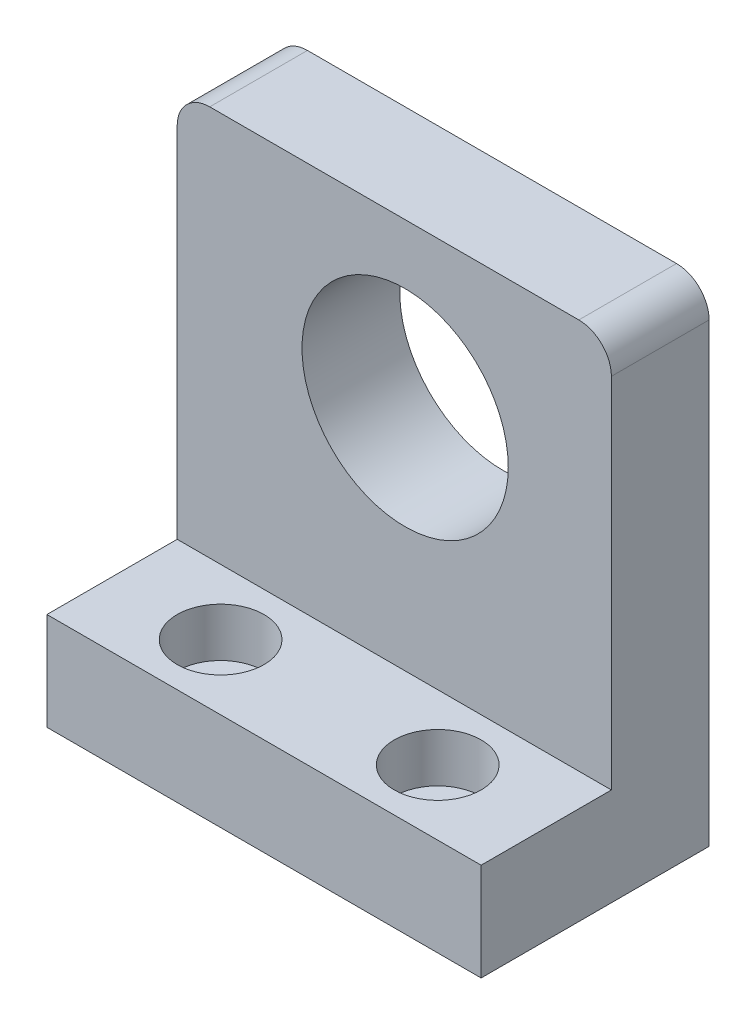
ISO-10303-21;
HEADER;
FILE_DESCRIPTION(('STEP AP214'),'2;1');
FILE_NAME('part.step','',(''),(''),'','','');
FILE_SCHEMA(('AUTOMOTIVE_DESIGN { 1 0 10303 214 1 1 1 1 }'));
ENDSEC;
DATA;
#1=APPLICATION_CONTEXT('core data for automotive mechanical design processes');
#2=APPLICATION_PROTOCOL_DEFINITION('international standard','automotive_design',2000,#1);
#3=PRODUCT_CONTEXT('',#1,'mechanical');
#4=PRODUCT('Part','Part','',(#3));
#5=PRODUCT_RELATED_PRODUCT_CATEGORY('part','',(#4));
#6=PRODUCT_DEFINITION_FORMATION('','',#4);
#7=PRODUCT_DEFINITION_CONTEXT('part definition',#1,'design');
#8=PRODUCT_DEFINITION('design','',#6,#7);
#9=PRODUCT_DEFINITION_SHAPE('','',#8);
#10=(LENGTH_UNIT() NAMED_UNIT(*) SI_UNIT(.MILLI.,.METRE.));
#11=(NAMED_UNIT(*) PLANE_ANGLE_UNIT() SI_UNIT($,.RADIAN.));
#12=(NAMED_UNIT(*) SI_UNIT($,.STERADIAN.) SOLID_ANGLE_UNIT());
#13=UNCERTAINTY_MEASURE_WITH_UNIT(LENGTH_MEASURE(1.E-05),#10,'distance_accuracy_value','');
#14=(GEOMETRIC_REPRESENTATION_CONTEXT(3) GLOBAL_UNCERTAINTY_ASSIGNED_CONTEXT((#13)) GLOBAL_UNIT_ASSIGNED_CONTEXT((#10,
#11,#12)) REPRESENTATION_CONTEXT('',''));
#15=CARTESIAN_POINT('',(0.,0.,0.));
#16=DIRECTION('',(0.,0.,1.));
#17=DIRECTION('',(1.,0.,0.));
#18=AXIS2_PLACEMENT_3D('',#15,#16,#17);
#19=CARTESIAN_POINT('',(10.,-22.5,15.));
#20=DIRECTION('',(0.,1.,0.));
#21=DIRECTION('',(0.,0.,1.));
#22=AXIS2_PLACEMENT_3D('',#19,#20,#21);
#23=CYLINDRICAL_SURFACE('',#22,2.);
#24=CARTESIAN_POINT('',(10.,-22.5,15.));
#25=DIRECTION('',(0.,1.,0.));
#26=DIRECTION('',(0.,0.,1.));
#27=AXIS2_PLACEMENT_3D('',#24,#25,#26);
#28=CIRCLE('',#27,2.);
#29=CARTESIAN_POINT('',(10.,-22.5,17.));
#30=VERTEX_POINT('',#29);
#31=EDGE_CURVE('E174',#30,#30,#28,.T.);
#32=ORIENTED_EDGE('',*,*,#31,.F.);
#33=EDGE_LOOP('',(#32));
#34=FACE_BOUND('',#33,.T.);
#35=CARTESIAN_POINT('',(10.,-18.,15.));
#36=DIRECTION('',(0.,1.,0.));
#37=DIRECTION('',(0.,0.,1.));
#38=AXIS2_PLACEMENT_3D('',#35,#36,#37);
#39=CIRCLE('',#38,2.);
#40=CARTESIAN_POINT('',(10.,-18.,17.));
#41=VERTEX_POINT('',#40);
#42=EDGE_CURVE('E37',#41,#41,#39,.F.);
#43=ORIENTED_EDGE('',*,*,#42,.F.);
#44=EDGE_LOOP('',(#43));
#45=FACE_BOUND('',#44,.T.);
#46=ADVANCED_FACE('F33',(#34,#45),#23,.F.);
#47=CARTESIAN_POINT('',(-10.,-22.5,15.));
#48=DIRECTION('',(0.,1.,0.));
#49=DIRECTION('',(0.,0.,1.));
#50=AXIS2_PLACEMENT_3D('',#47,#48,#49);
#51=CYLINDRICAL_SURFACE('',#50,2.);
#52=CARTESIAN_POINT('',(-10.,-22.5,15.));
#53=DIRECTION('',(0.,1.,0.));
#54=DIRECTION('',(0.,0.,1.));
#55=AXIS2_PLACEMENT_3D('',#52,#53,#54);
#56=CIRCLE('',#55,2.);
#57=CARTESIAN_POINT('',(-10.,-22.5,17.));
#58=VERTEX_POINT('',#57);
#59=EDGE_CURVE('E129',#58,#58,#56,.T.);
#60=ORIENTED_EDGE('',*,*,#59,.F.);
#61=EDGE_LOOP('',(#60));
#62=FACE_BOUND('',#61,.T.);
#63=CARTESIAN_POINT('',(-10.,-18.,15.));
#64=DIRECTION('',(0.,1.,0.));
#65=DIRECTION('',(0.,0.,1.));
#66=AXIS2_PLACEMENT_3D('',#63,#64,#65);
#67=CIRCLE('',#66,2.);
#68=CARTESIAN_POINT('',(-10.,-18.,17.));
#69=VERTEX_POINT('',#68);
#70=EDGE_CURVE('E172',#69,#69,#67,.F.);
#71=ORIENTED_EDGE('',*,*,#70,.F.);
#72=EDGE_LOOP('',(#71));
#73=FACE_BOUND('',#72,.T.);
#74=ADVANCED_FACE('F200',(#62,#73),#51,.F.);
#75=CARTESIAN_POINT('',(-17.,19.5,9.));
#76=DIRECTION('',(0.,0.,1.));
#77=DIRECTION('',(1.,0.,0.));
#78=AXIS2_PLACEMENT_3D('',#75,#76,#77);
#79=PLANE('',#78);
#80=DIRECTION('',(-1.,0.,0.));
#81=VECTOR('',#80,1.);
#82=CARTESIAN_POINT('',(-20.,-13.5,9.));
#83=LINE('',#82,#81);
#84=CARTESIAN_POINT('',(20.,-13.5,9.));
#85=VERTEX_POINT('',#84);
#86=CARTESIAN_POINT('',(-20.,-13.5,9.));
#87=VERTEX_POINT('',#86);
#88=EDGE_CURVE('E50',#85,#87,#83,.T.);
#89=ORIENTED_EDGE('',*,*,#88,.F.);
#90=DIRECTION('',(0.,1.,0.));
#91=VECTOR('',#90,1.);
#92=CARTESIAN_POINT('',(20.,19.5,9.));
#93=LINE('',#92,#91);
#94=CARTESIAN_POINT('',(20.,19.5,9.));
#95=VERTEX_POINT('',#94);
#96=EDGE_CURVE('E89',#85,#95,#93,.T.);
#97=ORIENTED_EDGE('',*,*,#96,.T.);
#98=CARTESIAN_POINT('',(17.,19.5,9.));
#99=DIRECTION('',(0.,0.,1.));
#100=DIRECTION('',(-1.,0.,0.));
#101=AXIS2_PLACEMENT_3D('',#98,#99,#100);
#102=CIRCLE('',#101,3.);
#103=CARTESIAN_POINT('',(17.,22.5,9.));
#104=VERTEX_POINT('',#103);
#105=EDGE_CURVE('E149',#95,#104,#102,.T.);
#106=ORIENTED_EDGE('',*,*,#105,.T.);
#107=DIRECTION('',(-1.,0.,0.));
#108=VECTOR('',#107,1.);
#109=CARTESIAN_POINT('',(-17.,22.5,9.));
#110=LINE('',#109,#108);
#111=CARTESIAN_POINT('',(-17.,22.5,9.));
#112=VERTEX_POINT('',#111);
#113=EDGE_CURVE('E151',#104,#112,#110,.T.);
#114=ORIENTED_EDGE('',*,*,#113,.T.);
#115=CARTESIAN_POINT('',(-17.,19.5,9.));
#116=DIRECTION('',(0.,0.,1.));
#117=DIRECTION('',(1.,0.,0.));
#118=AXIS2_PLACEMENT_3D('',#115,#116,#117);
#119=CIRCLE('',#118,3.);
#120=CARTESIAN_POINT('',(-20.,19.5,9.));
#121=VERTEX_POINT('',#120);
#122=EDGE_CURVE('E57',#112,#121,#119,.T.);
#123=ORIENTED_EDGE('',*,*,#122,.T.);
#124=DIRECTION('',(0.,-1.,0.));
#125=VECTOR('',#124,1.);
#126=CARTESIAN_POINT('',(-20.,19.5,9.));
#127=LINE('',#126,#125);
#128=EDGE_CURVE('E154',#121,#87,#127,.T.);
#129=ORIENTED_EDGE('',*,*,#128,.T.);
#130=EDGE_LOOP('',(#89,#97,#106,#114,#123,#129));
#131=FACE_BOUND('',#130,.T.);
#132=CARTESIAN_POINT('',(0.999999999999997,7.49999999999999,9.));
#133=DIRECTION('',(0.,0.,1.));
#134=DIRECTION('',(1.,0.,0.));
#135=AXIS2_PLACEMENT_3D('',#132,#133,#134);
#136=CIRCLE('',#135,9.5);
#137=CARTESIAN_POINT('',(10.5,7.49999999999999,9.));
#138=VERTEX_POINT('',#137);
#139=EDGE_CURVE('E142',#138,#138,#136,.T.);
#140=ORIENTED_EDGE('',*,*,#139,.F.);
#141=EDGE_LOOP('',(#140));
#142=FACE_BOUND('',#141,.T.);
#143=ADVANCED_FACE('F206',(#131,#142),#79,.T.);
#144=CARTESIAN_POINT('',(-17.,19.5,0.));
#145=DIRECTION('',(0.,0.,1.));
#146=DIRECTION('',(1.,0.,0.));
#147=AXIS2_PLACEMENT_3D('',#144,#145,#146);
#148=PLANE('',#147);
#149=DIRECTION('',(0.,1.,0.));
#150=VECTOR('',#149,1.);
#151=CARTESIAN_POINT('',(20.,19.5,0.));
#152=LINE('',#151,#150);
#153=CARTESIAN_POINT('',(20.,-22.5,0.));
#154=VERTEX_POINT('',#153);
#155=CARTESIAN_POINT('',(20.,19.5,0.));
#156=VERTEX_POINT('',#155);
#157=EDGE_CURVE('E145',#154,#156,#152,.T.);
#158=ORIENTED_EDGE('',*,*,#157,.F.);
#159=DIRECTION('',(1.,0.,0.));
#160=VECTOR('',#159,1.);
#161=CARTESIAN_POINT('',(-20.,-22.5,0.));
#162=LINE('',#161,#160);
#163=CARTESIAN_POINT('',(-20.,-22.5,0.));
#164=VERTEX_POINT('',#163);
#165=EDGE_CURVE('E85',#164,#154,#162,.T.);
#166=ORIENTED_EDGE('',*,*,#165,.F.);
#167=DIRECTION('',(0.,-1.,0.));
#168=VECTOR('',#167,1.);
#169=CARTESIAN_POINT('',(-20.,19.5,0.));
#170=LINE('',#169,#168);
#171=CARTESIAN_POINT('',(-20.,19.5,0.));
#172=VERTEX_POINT('',#171);
#173=EDGE_CURVE('E113',#172,#164,#170,.T.);
#174=ORIENTED_EDGE('',*,*,#173,.F.);
#175=CARTESIAN_POINT('',(-17.,19.5,0.));
#176=DIRECTION('',(0.,0.,1.));
#177=DIRECTION('',(1.,0.,0.));
#178=AXIS2_PLACEMENT_3D('',#175,#176,#177);
#179=CIRCLE('',#178,3.);
#180=CARTESIAN_POINT('',(-17.,22.5,0.));
#181=VERTEX_POINT('',#180);
#182=EDGE_CURVE('E162',#181,#172,#179,.T.);
#183=ORIENTED_EDGE('',*,*,#182,.F.);
#184=DIRECTION('',(-1.,0.,0.));
#185=VECTOR('',#184,1.);
#186=CARTESIAN_POINT('',(-17.,22.5,0.));
#187=LINE('',#186,#185);
#188=CARTESIAN_POINT('',(17.,22.5,0.));
#189=VERTEX_POINT('',#188);
#190=EDGE_CURVE('E160',#189,#181,#187,.T.);
#191=ORIENTED_EDGE('',*,*,#190,.F.);
#192=CARTESIAN_POINT('',(17.,19.5,0.));
#193=DIRECTION('',(0.,0.,1.));
#194=DIRECTION('',(-1.,0.,0.));
#195=AXIS2_PLACEMENT_3D('',#192,#193,#194);
#196=CIRCLE('',#195,3.);
#197=EDGE_CURVE('E158',#156,#189,#196,.T.);
#198=ORIENTED_EDGE('',*,*,#197,.F.);
#199=EDGE_LOOP('',(#158,#166,#174,#183,#191,#198));
#200=FACE_BOUND('',#199,.T.);
#201=CARTESIAN_POINT('',(0.999999999999997,7.49999999999999,0.));
#202=DIRECTION('',(0.,0.,1.));
#203=DIRECTION('',(1.,0.,0.));
#204=AXIS2_PLACEMENT_3D('',#201,#202,#203);
#205=CIRCLE('',#204,9.5);
#206=CARTESIAN_POINT('',(10.5,7.49999999999999,0.));
#207=VERTEX_POINT('',#206);
#208=EDGE_CURVE('E141',#207,#207,#205,.T.);
#209=ORIENTED_EDGE('',*,*,#208,.T.);
#210=EDGE_LOOP('',(#209));
#211=FACE_BOUND('',#210,.T.);
#212=ADVANCED_FACE('F227',(#200,#211),#148,.F.);
#213=CARTESIAN_POINT('',(20.,19.5,9.));
#214=DIRECTION('',(-1.,0.,0.));
#215=DIRECTION('',(0.,-1.,0.));
#216=AXIS2_PLACEMENT_3D('',#213,#214,#215);
#217=PLANE('',#216);
#218=ORIENTED_EDGE('',*,*,#157,.T.);
#219=DIRECTION('',(0.,0.,-1.));
#220=VECTOR('',#219,1.);
#221=CARTESIAN_POINT('',(20.,19.5,9.));
#222=LINE('',#221,#220);
#223=EDGE_CURVE('E11',#95,#156,#222,.T.);
#224=ORIENTED_EDGE('',*,*,#223,.F.);
#225=ORIENTED_EDGE('',*,*,#96,.F.);
#226=DIRECTION('',(0.,0.,-1.));
#227=VECTOR('',#226,1.);
#228=CARTESIAN_POINT('',(20.,-13.5,21.));
#229=LINE('',#228,#227);
#230=CARTESIAN_POINT('',(20.,-13.5,21.));
#231=VERTEX_POINT('',#230);
#232=EDGE_CURVE('E138',#231,#85,#229,.T.);
#233=ORIENTED_EDGE('',*,*,#232,.F.);
#234=DIRECTION('',(0.,1.,0.));
#235=VECTOR('',#234,1.);
#236=CARTESIAN_POINT('',(20.,-22.5,21.));
#237=LINE('',#236,#235);
#238=CARTESIAN_POINT('',(20.,-22.5,21.));
#239=VERTEX_POINT('',#238);
#240=EDGE_CURVE('E122',#239,#231,#237,.T.);
#241=ORIENTED_EDGE('',*,*,#240,.F.);
#242=DIRECTION('',(0.,0.,-1.));
#243=VECTOR('',#242,1.);
#244=CARTESIAN_POINT('',(20.,-22.5,9.));
#245=LINE('',#244,#243);
#246=EDGE_CURVE('E115',#239,#154,#245,.T.);
#247=ORIENTED_EDGE('',*,*,#246,.T.);
#248=EDGE_LOOP('',(#218,#224,#225,#233,#241,#247));
#249=FACE_BOUND('',#248,.T.);
#250=ADVANCED_FACE('F35',(#249),#217,.F.);
#251=CARTESIAN_POINT('',(17.,19.5,9.));
#252=DIRECTION('',(0.,0.,-1.));
#253=DIRECTION('',(-1.,0.,0.));
#254=AXIS2_PLACEMENT_3D('',#251,#252,#253);
#255=CYLINDRICAL_SURFACE('',#254,3.);
#256=ORIENTED_EDGE('',*,*,#197,.T.);
#257=DIRECTION('',(0.,0.,-1.));
#258=VECTOR('',#257,1.);
#259=CARTESIAN_POINT('',(17.,22.5,9.));
#260=LINE('',#259,#258);
#261=EDGE_CURVE('E42',#104,#189,#260,.T.);
#262=ORIENTED_EDGE('',*,*,#261,.F.);
#263=ORIENTED_EDGE('',*,*,#105,.F.);
#264=ORIENTED_EDGE('',*,*,#223,.T.);
#265=EDGE_LOOP('',(#256,#262,#263,#264));
#266=FACE_BOUND('',#265,.T.);
#267=ADVANCED_FACE('F242',(#266),#255,.T.);
#268=CARTESIAN_POINT('',(-17.,22.5,9.));
#269=DIRECTION('',(0.,-1.,0.));
#270=DIRECTION('',(1.,0.,0.));
#271=AXIS2_PLACEMENT_3D('',#268,#269,#270);
#272=PLANE('',#271);
#273=ORIENTED_EDGE('',*,*,#190,.T.);
#274=DIRECTION('',(0.,0.,-1.));
#275=VECTOR('',#274,1.);
#276=CARTESIAN_POINT('',(-17.,22.5,9.));
#277=LINE('',#276,#275);
#278=EDGE_CURVE('E168',#112,#181,#277,.T.);
#279=ORIENTED_EDGE('',*,*,#278,.F.);
#280=ORIENTED_EDGE('',*,*,#113,.F.);
#281=ORIENTED_EDGE('',*,*,#261,.T.);
#282=EDGE_LOOP('',(#273,#279,#280,#281));
#283=FACE_BOUND('',#282,.T.);
#284=ADVANCED_FACE('F239',(#283),#272,.F.);
#285=CARTESIAN_POINT('',(-17.,19.5,9.));
#286=DIRECTION('',(0.,0.,-1.));
#287=DIRECTION('',(-1.,0.,0.));
#288=AXIS2_PLACEMENT_3D('',#285,#286,#287);
#289=CYLINDRICAL_SURFACE('',#288,3.);
#290=ORIENTED_EDGE('',*,*,#182,.T.);
#291=DIRECTION('',(0.,0.,-1.));
#292=VECTOR('',#291,1.);
#293=CARTESIAN_POINT('',(-20.,19.5,9.));
#294=LINE('',#293,#292);
#295=EDGE_CURVE('E114',#121,#172,#294,.T.);
#296=ORIENTED_EDGE('',*,*,#295,.F.);
#297=ORIENTED_EDGE('',*,*,#122,.F.);
#298=ORIENTED_EDGE('',*,*,#278,.T.);
#299=EDGE_LOOP('',(#290,#296,#297,#298));
#300=FACE_BOUND('',#299,.T.);
#301=ADVANCED_FACE('F236',(#300),#289,.T.);
#302=CARTESIAN_POINT('',(-20.,19.5,9.));
#303=DIRECTION('',(1.,0.,0.));
#304=DIRECTION('',(0.,1.,0.));
#305=AXIS2_PLACEMENT_3D('',#302,#303,#304);
#306=PLANE('',#305);
#307=ORIENTED_EDGE('',*,*,#173,.T.);
#308=DIRECTION('',(0.,0.,-1.));
#309=VECTOR('',#308,1.);
#310=CARTESIAN_POINT('',(-20.,-22.5,9.));
#311=LINE('',#310,#309);
#312=CARTESIAN_POINT('',(-20.,-22.5,21.));
#313=VERTEX_POINT('',#312);
#314=EDGE_CURVE('E105',#313,#164,#311,.T.);
#315=ORIENTED_EDGE('',*,*,#314,.F.);
#316=DIRECTION('',(0.,-1.,0.));
#317=VECTOR('',#316,1.);
#318=CARTESIAN_POINT('',(-20.,-22.5,21.));
#319=LINE('',#318,#317);
#320=CARTESIAN_POINT('',(-20.,-13.5,21.));
#321=VERTEX_POINT('',#320);
#322=EDGE_CURVE('E110',#321,#313,#319,.T.);
#323=ORIENTED_EDGE('',*,*,#322,.F.);
#324=DIRECTION('',(0.,0.,-1.));
#325=VECTOR('',#324,1.);
#326=CARTESIAN_POINT('',(-20.,-13.5,21.));
#327=LINE('',#326,#325);
#328=EDGE_CURVE('E135',#321,#87,#327,.T.);
#329=ORIENTED_EDGE('',*,*,#328,.T.);
#330=ORIENTED_EDGE('',*,*,#128,.F.);
#331=ORIENTED_EDGE('',*,*,#295,.T.);
#332=EDGE_LOOP('',(#307,#315,#323,#329,#330,#331));
#333=FACE_BOUND('',#332,.T.);
#334=ADVANCED_FACE('F107',(#333),#306,.F.);
#335=CARTESIAN_POINT('',(-20.,-22.5,9.));
#336=DIRECTION('',(0.,1.,0.));
#337=DIRECTION('',(0.,0.,1.));
#338=AXIS2_PLACEMENT_3D('',#335,#336,#337);
#339=PLANE('',#338);
#340=ORIENTED_EDGE('',*,*,#31,.T.);
#341=EDGE_LOOP('',(#340));
#342=FACE_BOUND('',#341,.T.);
#343=ORIENTED_EDGE('',*,*,#59,.T.);
#344=EDGE_LOOP('',(#343));
#345=FACE_BOUND('',#344,.T.);
#346=ORIENTED_EDGE('',*,*,#165,.T.);
#347=ORIENTED_EDGE('',*,*,#246,.F.);
#348=DIRECTION('',(1.,0.,0.));
#349=VECTOR('',#348,1.);
#350=CARTESIAN_POINT('',(-20.,-22.5,21.));
#351=LINE('',#350,#349);
#352=EDGE_CURVE('E118',#313,#239,#351,.T.);
#353=ORIENTED_EDGE('',*,*,#352,.F.);
#354=ORIENTED_EDGE('',*,*,#314,.T.);
#355=EDGE_LOOP('',(#346,#347,#353,#354));
#356=FACE_BOUND('',#355,.T.);
#357=ADVANCED_FACE('F119',(#342,#345,#356),#339,.F.);
#358=CARTESIAN_POINT('',(0.999999999999997,7.49999999999999,9.));
#359=DIRECTION('',(0.,0.,-1.));
#360=DIRECTION('',(-1.,0.,0.));
#361=AXIS2_PLACEMENT_3D('',#358,#359,#360);
#362=CYLINDRICAL_SURFACE('',#361,9.5);
#363=ORIENTED_EDGE('',*,*,#139,.T.);
#364=EDGE_LOOP('',(#363));
#365=FACE_BOUND('',#364,.T.);
#366=ORIENTED_EDGE('',*,*,#208,.F.);
#367=EDGE_LOOP('',(#366));
#368=FACE_BOUND('',#367,.T.);
#369=ADVANCED_FACE('F220',(#365,#368),#362,.F.);
#370=CARTESIAN_POINT('',(-20.,-13.5,21.));
#371=DIRECTION('',(0.,-1.,0.));
#372=DIRECTION('',(0.,0.,-1.));
#373=AXIS2_PLACEMENT_3D('',#370,#371,#372);
#374=PLANE('',#373);
#375=CARTESIAN_POINT('',(10.,-13.5,15.));
#376=DIRECTION('',(0.,1.,0.));
#377=DIRECTION('',(0.,0.,1.));
#378=AXIS2_PLACEMENT_3D('',#375,#376,#377);
#379=CIRCLE('',#378,4.);
#380=CARTESIAN_POINT('',(10.,-13.5,19.));
#381=VERTEX_POINT('',#380);
#382=EDGE_CURVE('E187',#381,#381,#379,.T.);
#383=ORIENTED_EDGE('',*,*,#382,.F.);
#384=EDGE_LOOP('',(#383));
#385=FACE_BOUND('',#384,.T.);
#386=CARTESIAN_POINT('',(-10.,-13.5,15.));
#387=DIRECTION('',(0.,1.,0.));
#388=DIRECTION('',(0.,0.,1.));
#389=AXIS2_PLACEMENT_3D('',#386,#387,#388);
#390=CIRCLE('',#389,4.);
#391=CARTESIAN_POINT('',(-10.,-13.5,19.));
#392=VERTEX_POINT('',#391);
#393=EDGE_CURVE('E180',#392,#392,#390,.T.);
#394=ORIENTED_EDGE('',*,*,#393,.F.);
#395=EDGE_LOOP('',(#394));
#396=FACE_BOUND('',#395,.T.);
#397=ORIENTED_EDGE('',*,*,#88,.T.);
#398=ORIENTED_EDGE('',*,*,#328,.F.);
#399=DIRECTION('',(-1.,0.,0.));
#400=VECTOR('',#399,1.);
#401=CARTESIAN_POINT('',(-20.,-13.5,21.));
#402=LINE('',#401,#400);
#403=EDGE_CURVE('E126',#231,#321,#402,.T.);
#404=ORIENTED_EDGE('',*,*,#403,.F.);
#405=ORIENTED_EDGE('',*,*,#232,.T.);
#406=EDGE_LOOP('',(#397,#398,#404,#405));
#407=FACE_BOUND('',#406,.T.);
#408=ADVANCED_FACE('F217',(#385,#396,#407),#374,.F.);
#409=CARTESIAN_POINT('',(0.,0.,21.));
#410=DIRECTION('',(0.,0.,-1.));
#411=DIRECTION('',(-1.,0.,0.));
#412=AXIS2_PLACEMENT_3D('',#409,#410,#411);
#413=PLANE('',#412);
#414=ORIENTED_EDGE('',*,*,#322,.T.);
#415=ORIENTED_EDGE('',*,*,#352,.T.);
#416=ORIENTED_EDGE('',*,*,#240,.T.);
#417=ORIENTED_EDGE('',*,*,#403,.T.);
#418=EDGE_LOOP('',(#414,#415,#416,#417));
#419=FACE_BOUND('',#418,.T.);
#420=ADVANCED_FACE('F124',(#419),#413,.F.);
#421=CARTESIAN_POINT('',(-10.,-18.,15.));
#422=DIRECTION('',(0.,1.,0.));
#423=DIRECTION('',(0.,0.,1.));
#424=AXIS2_PLACEMENT_3D('',#421,#422,#423);
#425=PLANE('',#424);
#426=CARTESIAN_POINT('',(-10.,-18.,15.));
#427=DIRECTION('',(0.,1.,0.));
#428=DIRECTION('',(0.,0.,1.));
#429=AXIS2_PLACEMENT_3D('',#426,#427,#428);
#430=CIRCLE('',#429,4.);
#431=CARTESIAN_POINT('',(-10.,-18.,19.));
#432=VERTEX_POINT('',#431);
#433=EDGE_CURVE('E175',#432,#432,#430,.T.);
#434=ORIENTED_EDGE('',*,*,#433,.T.);
#435=EDGE_LOOP('',(#434));
#436=FACE_BOUND('',#435,.T.);
#437=ORIENTED_EDGE('',*,*,#70,.T.);
#438=EDGE_LOOP('',(#437));
#439=FACE_BOUND('',#438,.T.);
#440=ADVANCED_FACE('F216',(#436,#439),#425,.T.);
#441=CARTESIAN_POINT('',(-10.,-18.,15.));
#442=DIRECTION('',(0.,1.,0.));
#443=DIRECTION('',(0.,0.,1.));
#444=AXIS2_PLACEMENT_3D('',#441,#442,#443);
#445=CYLINDRICAL_SURFACE('',#444,4.);
#446=ORIENTED_EDGE('',*,*,#433,.F.);
#447=EDGE_LOOP('',(#446));
#448=FACE_BOUND('',#447,.T.);
#449=ORIENTED_EDGE('',*,*,#393,.T.);
#450=EDGE_LOOP('',(#449));
#451=FACE_BOUND('',#450,.T.);
#452=ADVANCED_FACE('F211',(#448,#451),#445,.F.);
#453=CARTESIAN_POINT('',(10.,-18.,15.));
#454=DIRECTION('',(0.,1.,0.));
#455=DIRECTION('',(0.,0.,1.));
#456=AXIS2_PLACEMENT_3D('',#453,#454,#455);
#457=PLANE('',#456);
#458=CARTESIAN_POINT('',(10.,-18.,15.));
#459=DIRECTION('',(0.,1.,0.));
#460=DIRECTION('',(0.,0.,1.));
#461=AXIS2_PLACEMENT_3D('',#458,#459,#460);
#462=CIRCLE('',#461,4.);
#463=CARTESIAN_POINT('',(10.,-18.,19.));
#464=VERTEX_POINT('',#463);
#465=EDGE_CURVE('E190',#464,#464,#462,.T.);
#466=ORIENTED_EDGE('',*,*,#465,.T.);
#467=EDGE_LOOP('',(#466));
#468=FACE_BOUND('',#467,.T.);
#469=ORIENTED_EDGE('',*,*,#42,.T.);
#470=EDGE_LOOP('',(#469));
#471=FACE_BOUND('',#470,.T.);
#472=ADVANCED_FACE('F197',(#468,#471),#457,.T.);
#473=CARTESIAN_POINT('',(10.,-18.,15.));
#474=DIRECTION('',(0.,1.,0.));
#475=DIRECTION('',(0.,0.,1.));
#476=AXIS2_PLACEMENT_3D('',#473,#474,#475);
#477=CYLINDRICAL_SURFACE('',#476,4.);
#478=ORIENTED_EDGE('',*,*,#465,.F.);
#479=EDGE_LOOP('',(#478));
#480=FACE_BOUND('',#479,.T.);
#481=ORIENTED_EDGE('',*,*,#382,.T.);
#482=EDGE_LOOP('',(#481));
#483=FACE_BOUND('',#482,.T.);
#484=ADVANCED_FACE('F316',(#480,#483),#477,.F.);
#485=CLOSED_SHELL('',(#46,#74,#143,#212,#250,#267,#284,#301,#334,#357,#369,#408,#420,#440,#452,
#472,#484));
#486=MANIFOLD_SOLID_BREP('B2',#485);
#487=ADVANCED_BREP_SHAPE_REPRESENTATION('',(#18,#486),#14);
#488=SHAPE_DEFINITION_REPRESENTATION(#9,#487);
ENDSEC;
END-ISO-10303-21;
